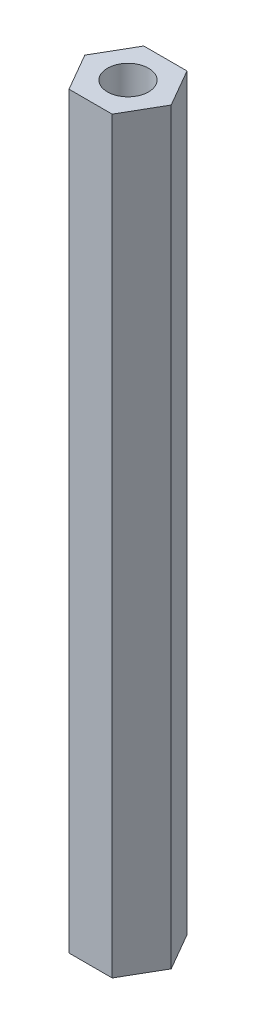
ISO-10303-21;
HEADER;
FILE_DESCRIPTION(('STEP AP214'),'2;1');
FILE_NAME('part.step','',(''),(''),'','','');
FILE_SCHEMA(('AUTOMOTIVE_DESIGN { 1 0 10303 214 1 1 1 1 }'));
ENDSEC;
DATA;
#1=APPLICATION_CONTEXT('core data for automotive mechanical design processes');
#2=APPLICATION_PROTOCOL_DEFINITION('international standard','automotive_design',2000,#1);
#3=PRODUCT_CONTEXT('',#1,'mechanical');
#4=PRODUCT('Part','Part','',(#3));
#5=PRODUCT_RELATED_PRODUCT_CATEGORY('part','',(#4));
#6=PRODUCT_DEFINITION_FORMATION('','',#4);
#7=PRODUCT_DEFINITION_CONTEXT('part definition',#1,'design');
#8=PRODUCT_DEFINITION('design','',#6,#7);
#9=PRODUCT_DEFINITION_SHAPE('','',#8);
#10=(LENGTH_UNIT() NAMED_UNIT(*) SI_UNIT(.MILLI.,.METRE.));
#11=(NAMED_UNIT(*) PLANE_ANGLE_UNIT() SI_UNIT($,.RADIAN.));
#12=(NAMED_UNIT(*) SI_UNIT($,.STERADIAN.) SOLID_ANGLE_UNIT());
#13=UNCERTAINTY_MEASURE_WITH_UNIT(LENGTH_MEASURE(1.E-05),#10,'distance_accuracy_value','');
#14=(GEOMETRIC_REPRESENTATION_CONTEXT(3) GLOBAL_UNCERTAINTY_ASSIGNED_CONTEXT((#13)) GLOBAL_UNIT_ASSIGNED_CONTEXT((#10,
#11,#12)) REPRESENTATION_CONTEXT('',''));
#15=CARTESIAN_POINT('',(0.,0.,0.));
#16=DIRECTION('',(0.,0.,1.));
#17=DIRECTION('',(1.,0.,0.));
#18=AXIS2_PLACEMENT_3D('',#15,#16,#17);
#19=CARTESIAN_POINT('',(1.73205080756891,30.,2.99999999999997));
#20=DIRECTION('',(-0.866025403784441,0.,-0.499999999999995));
#21=DIRECTION('',(-0.499999999999995,0.,0.866025403784441));
#22=AXIS2_PLACEMENT_3D('',#19,#20,#21);
#23=PLANE('',#22);
#24=DIRECTION('',(0.499999999999995,0.,-0.866025403784441));
#25=VECTOR('',#24,1.);
#26=CARTESIAN_POINT('',(1.73205080756891,-30.,2.99999999999997));
#27=LINE('',#26,#25);
#28=CARTESIAN_POINT('',(1.73205080756891,-30.,2.99999999999997));
#29=VERTEX_POINT('',#28);
#30=CARTESIAN_POINT('',(3.46410161513774,-30.,0.));
#31=VERTEX_POINT('',#30);
#32=EDGE_CURVE('E135',#29,#31,#27,.T.);
#33=ORIENTED_EDGE('',*,*,#32,.T.);
#34=DIRECTION('',(0.,-1.,0.));
#35=VECTOR('',#34,1.);
#36=CARTESIAN_POINT('',(3.46410161513774,30.,0.));
#37=LINE('',#36,#35);
#38=CARTESIAN_POINT('',(3.46410161513774,30.,0.));
#39=VERTEX_POINT('',#38);
#40=EDGE_CURVE('E11',#39,#31,#37,.T.);
#41=ORIENTED_EDGE('',*,*,#40,.F.);
#42=DIRECTION('',(0.499999999999995,0.,-0.866025403784441));
#43=VECTOR('',#42,1.);
#44=CARTESIAN_POINT('',(1.73205080756891,30.,2.99999999999997));
#45=LINE('',#44,#43);
#46=CARTESIAN_POINT('',(1.73205080756891,30.,2.99999999999997));
#47=VERTEX_POINT('',#46);
#48=EDGE_CURVE('E152',#47,#39,#45,.T.);
#49=ORIENTED_EDGE('',*,*,#48,.F.);
#50=DIRECTION('',(0.,-1.,0.));
#51=VECTOR('',#50,1.);
#52=CARTESIAN_POINT('',(1.73205080756891,30.,2.99999999999997));
#53=LINE('',#52,#51);
#54=EDGE_CURVE('E131',#47,#29,#53,.T.);
#55=ORIENTED_EDGE('',*,*,#54,.T.);
#56=EDGE_LOOP('',(#33,#41,#49,#55));
#57=FACE_BOUND('',#56,.T.);
#58=ADVANCED_FACE('F43',(#57),#23,.F.);
#59=CARTESIAN_POINT('',(3.46410161513774,30.,0.));
#60=DIRECTION('',(-0.866025403784438,0.,0.500000000000001));
#61=DIRECTION('',(0.500000000000001,0.,0.866025403784438));
#62=AXIS2_PLACEMENT_3D('',#59,#60,#61);
#63=PLANE('',#62);
#64=DIRECTION('',(-0.500000000000001,0.,-0.866025403784438));
#65=VECTOR('',#64,1.);
#66=CARTESIAN_POINT('',(3.46410161513774,-30.,0.));
#67=LINE('',#66,#65);
#68=CARTESIAN_POINT('',(1.73205080756886,-30.,-2.99999999999999));
#69=VERTEX_POINT('',#68);
#70=EDGE_CURVE('E139',#31,#69,#67,.T.);
#71=ORIENTED_EDGE('',*,*,#70,.T.);
#72=DIRECTION('',(0.,-1.,0.));
#73=VECTOR('',#72,1.);
#74=CARTESIAN_POINT('',(1.73205080756886,30.,-2.99999999999999));
#75=LINE('',#74,#73);
#76=CARTESIAN_POINT('',(1.73205080756886,30.,-2.99999999999999));
#77=VERTEX_POINT('',#76);
#78=EDGE_CURVE('E52',#77,#69,#75,.T.);
#79=ORIENTED_EDGE('',*,*,#78,.F.);
#80=DIRECTION('',(-0.500000000000001,0.,-0.866025403784438));
#81=VECTOR('',#80,1.);
#82=CARTESIAN_POINT('',(3.46410161513774,30.,0.));
#83=LINE('',#82,#81);
#84=EDGE_CURVE('E98',#39,#77,#83,.T.);
#85=ORIENTED_EDGE('',*,*,#84,.F.);
#86=ORIENTED_EDGE('',*,*,#40,.T.);
#87=EDGE_LOOP('',(#71,#79,#85,#86));
#88=FACE_BOUND('',#87,.T.);
#89=ADVANCED_FACE('F181',(#88),#63,.F.);
#90=CARTESIAN_POINT('',(1.73205080756886,30.,-2.99999999999999));
#91=DIRECTION('',(0.,0.,1.));
#92=DIRECTION('',(1.,0.,0.));
#93=AXIS2_PLACEMENT_3D('',#90,#91,#92);
#94=PLANE('',#93);
#95=DIRECTION('',(-1.,0.,0.));
#96=VECTOR('',#95,1.);
#97=CARTESIAN_POINT('',(1.73205080756886,-30.,-2.99999999999999));
#98=LINE('',#97,#96);
#99=CARTESIAN_POINT('',(-1.73205080756888,-30.,-2.99999999999998));
#100=VERTEX_POINT('',#99);
#101=EDGE_CURVE('E143',#69,#100,#98,.T.);
#102=ORIENTED_EDGE('',*,*,#101,.T.);
#103=DIRECTION('',(0.,-1.,0.));
#104=VECTOR('',#103,1.);
#105=CARTESIAN_POINT('',(-1.73205080756888,30.,-2.99999999999998));
#106=LINE('',#105,#104);
#107=CARTESIAN_POINT('',(-1.73205080756888,30.,-2.99999999999998));
#108=VERTEX_POINT('',#107);
#109=EDGE_CURVE('E124',#108,#100,#106,.T.);
#110=ORIENTED_EDGE('',*,*,#109,.F.);
#111=DIRECTION('',(-1.,0.,0.));
#112=VECTOR('',#111,1.);
#113=CARTESIAN_POINT('',(1.73205080756886,30.,-2.99999999999999));
#114=LINE('',#113,#112);
#115=EDGE_CURVE('E113',#77,#108,#114,.T.);
#116=ORIENTED_EDGE('',*,*,#115,.F.);
#117=ORIENTED_EDGE('',*,*,#78,.T.);
#118=EDGE_LOOP('',(#102,#110,#116,#117));
#119=FACE_BOUND('',#118,.T.);
#120=ADVANCED_FACE('F162',(#119),#94,.F.);
#121=CARTESIAN_POINT('',(-1.73205080756888,30.,-2.99999999999998));
#122=DIRECTION('',(0.866025403784441,0.,0.499999999999995));
#123=DIRECTION('',(0.499999999999995,0.,-0.866025403784442));
#124=AXIS2_PLACEMENT_3D('',#121,#122,#123);
#125=PLANE('',#124);
#126=DIRECTION('',(-0.499999999999995,0.,0.866025403784442));
#127=VECTOR('',#126,1.);
#128=CARTESIAN_POINT('',(-1.73205080756888,-30.,-2.99999999999998));
#129=LINE('',#128,#127);
#130=CARTESIAN_POINT('',(-3.46410161513774,-30.,0.));
#131=VERTEX_POINT('',#130);
#132=EDGE_CURVE('E122',#100,#131,#129,.T.);
#133=ORIENTED_EDGE('',*,*,#132,.T.);
#134=DIRECTION('',(0.,-1.,0.));
#135=VECTOR('',#134,1.);
#136=CARTESIAN_POINT('',(-3.46410161513774,30.,0.));
#137=LINE('',#136,#135);
#138=CARTESIAN_POINT('',(-3.46410161513774,30.,0.));
#139=VERTEX_POINT('',#138);
#140=EDGE_CURVE('E119',#139,#131,#137,.T.);
#141=ORIENTED_EDGE('',*,*,#140,.F.);
#142=DIRECTION('',(-0.499999999999995,0.,0.866025403784442));
#143=VECTOR('',#142,1.);
#144=CARTESIAN_POINT('',(-1.73205080756888,30.,-2.99999999999998));
#145=LINE('',#144,#143);
#146=EDGE_CURVE('E107',#108,#139,#145,.T.);
#147=ORIENTED_EDGE('',*,*,#146,.F.);
#148=ORIENTED_EDGE('',*,*,#109,.T.);
#149=EDGE_LOOP('',(#133,#141,#147,#148));
#150=FACE_BOUND('',#149,.T.);
#151=ADVANCED_FACE('F120',(#150),#125,.F.);
#152=CARTESIAN_POINT('',(-3.46410161513774,30.,0.));
#153=DIRECTION('',(0.866025403784435,0.,-0.500000000000007));
#154=DIRECTION('',(-0.500000000000007,0.,-0.866025403784435));
#155=AXIS2_PLACEMENT_3D('',#152,#153,#154);
#156=PLANE('',#155);
#157=DIRECTION('',(0.500000000000007,0.,0.866025403784435));
#158=VECTOR('',#157,1.);
#159=CARTESIAN_POINT('',(-3.46410161513774,-30.,0.));
#160=LINE('',#159,#158);
#161=CARTESIAN_POINT('',(-1.73205080756884,-30.,3.));
#162=VERTEX_POINT('',#161);
#163=EDGE_CURVE('E84',#131,#162,#160,.T.);
#164=ORIENTED_EDGE('',*,*,#163,.T.);
#165=DIRECTION('',(0.,-1.,0.));
#166=VECTOR('',#165,1.);
#167=CARTESIAN_POINT('',(-1.73205080756884,30.,3.));
#168=LINE('',#167,#166);
#169=CARTESIAN_POINT('',(-1.73205080756884,30.,3.));
#170=VERTEX_POINT('',#169);
#171=EDGE_CURVE('E125',#170,#162,#168,.T.);
#172=ORIENTED_EDGE('',*,*,#171,.F.);
#173=DIRECTION('',(0.500000000000007,0.,0.866025403784435));
#174=VECTOR('',#173,1.);
#175=CARTESIAN_POINT('',(-3.46410161513774,30.,0.));
#176=LINE('',#175,#174);
#177=EDGE_CURVE('E111',#139,#170,#176,.T.);
#178=ORIENTED_EDGE('',*,*,#177,.F.);
#179=ORIENTED_EDGE('',*,*,#140,.T.);
#180=EDGE_LOOP('',(#164,#172,#178,#179));
#181=FACE_BOUND('',#180,.T.);
#182=ADVANCED_FACE('F127',(#181),#156,.F.);
#183=CARTESIAN_POINT('',(-1.73205080756884,30.,3.));
#184=DIRECTION('',(0.,0.,-1.));
#185=DIRECTION('',(-1.,0.,0.));
#186=AXIS2_PLACEMENT_3D('',#183,#184,#185);
#187=PLANE('',#186);
#188=DIRECTION('',(1.,0.,0.));
#189=VECTOR('',#188,1.);
#190=CARTESIAN_POINT('',(-1.73205080756884,-30.,3.));
#191=LINE('',#190,#189);
#192=EDGE_CURVE('E90',#162,#29,#191,.T.);
#193=ORIENTED_EDGE('',*,*,#192,.T.);
#194=ORIENTED_EDGE('',*,*,#54,.F.);
#195=DIRECTION('',(1.,0.,0.));
#196=VECTOR('',#195,1.);
#197=CARTESIAN_POINT('',(-1.73205080756884,30.,3.));
#198=LINE('',#197,#196);
#199=EDGE_CURVE('E60',#170,#47,#198,.T.);
#200=ORIENTED_EDGE('',*,*,#199,.F.);
#201=ORIENTED_EDGE('',*,*,#171,.T.);
#202=EDGE_LOOP('',(#193,#194,#200,#201));
#203=FACE_BOUND('',#202,.T.);
#204=ADVANCED_FACE('F169',(#203),#187,.F.);
#205=CARTESIAN_POINT('',(0.,30.,0.));
#206=DIRECTION('',(0.,1.,0.));
#207=DIRECTION('',(0.,0.,1.));
#208=AXIS2_PLACEMENT_3D('',#205,#206,#207);
#209=PLANE('',#208);
#210=CARTESIAN_POINT('',(0.,30.,0.));
#211=DIRECTION('',(0.,1.,0.));
#212=DIRECTION('',(0.,0.,1.));
#213=AXIS2_PLACEMENT_3D('',#210,#211,#212);
#214=CIRCLE('',#213,1.64999999999999);
#215=CARTESIAN_POINT('',(0.,30.,1.64999999999999));
#216=VERTEX_POINT('',#215);
#217=EDGE_CURVE('E275',#216,#216,#214,.T.);
#218=ORIENTED_EDGE('',*,*,#217,.F.);
#219=EDGE_LOOP('',(#218));
#220=FACE_BOUND('',#219,.T.);
#221=ORIENTED_EDGE('',*,*,#48,.T.);
#222=ORIENTED_EDGE('',*,*,#84,.T.);
#223=ORIENTED_EDGE('',*,*,#115,.T.);
#224=ORIENTED_EDGE('',*,*,#146,.T.);
#225=ORIENTED_EDGE('',*,*,#177,.T.);
#226=ORIENTED_EDGE('',*,*,#199,.T.);
#227=EDGE_LOOP('',(#221,#222,#223,#224,#225,#226));
#228=FACE_BOUND('',#227,.T.);
#229=ADVANCED_FACE('F109',(#220,#228),#209,.T.);
#230=CARTESIAN_POINT('',(0.,-30.,0.));
#231=DIRECTION('',(0.,1.,0.));
#232=DIRECTION('',(0.,0.,1.));
#233=AXIS2_PLACEMENT_3D('',#230,#231,#232);
#234=PLANE('',#233);
#235=CARTESIAN_POINT('',(0.,-30.,0.));
#236=DIRECTION('',(0.,-1.,0.));
#237=DIRECTION('',(0.,0.,-1.));
#238=AXIS2_PLACEMENT_3D('',#235,#236,#237);
#239=CIRCLE('',#238,1.64999999999999);
#240=CARTESIAN_POINT('',(0.,-30.,-1.64999999999999));
#241=VERTEX_POINT('',#240);
#242=EDGE_CURVE('E271',#241,#241,#239,.T.);
#243=ORIENTED_EDGE('',*,*,#242,.F.);
#244=EDGE_LOOP('',(#243));
#245=FACE_BOUND('',#244,.T.);
#246=ORIENTED_EDGE('',*,*,#32,.F.);
#247=ORIENTED_EDGE('',*,*,#192,.F.);
#248=ORIENTED_EDGE('',*,*,#163,.F.);
#249=ORIENTED_EDGE('',*,*,#132,.F.);
#250=ORIENTED_EDGE('',*,*,#101,.F.);
#251=ORIENTED_EDGE('',*,*,#70,.F.);
#252=EDGE_LOOP('',(#246,#247,#248,#249,#250,#251));
#253=FACE_BOUND('',#252,.T.);
#254=ADVANCED_FACE('F165',(#245,#253),#234,.F.);
#255=CARTESIAN_POINT('',(0.,19.9,0.));
#256=DIRECTION('',(0.,1.,0.));
#257=DIRECTION('',(0.,0.,1.));
#258=AXIS2_PLACEMENT_3D('',#255,#256,#257);
#259=CONICAL_SURFACE('',#258,1.64999999999999,1.02974425867665);
#260=CARTESIAN_POINT('',(0.,18.9085799786045,0.));
#261=VERTEX_POINT('',#260);
#262=VERTEX_LOOP('',#261);
#263=FACE_BOUND('',#262,.T.);
#264=CARTESIAN_POINT('',(0.,19.9,0.));
#265=DIRECTION('',(0.,1.,0.));
#266=DIRECTION('',(0.,0.,1.));
#267=AXIS2_PLACEMENT_3D('',#264,#265,#266);
#268=CIRCLE('',#267,1.64999999999999);
#269=CARTESIAN_POINT('',(0.,19.9,1.64999999999999));
#270=VERTEX_POINT('',#269);
#271=EDGE_CURVE('E140',#270,#270,#268,.T.);
#272=ORIENTED_EDGE('',*,*,#271,.T.);
#273=EDGE_LOOP('',(#272));
#274=FACE_BOUND('',#273,.T.);
#275=ADVANCED_FACE('F216',(#263,#274),#259,.F.);
#276=CARTESIAN_POINT('',(0.,30.,0.));
#277=DIRECTION('',(0.,1.,0.));
#278=DIRECTION('',(0.,0.,1.));
#279=AXIS2_PLACEMENT_3D('',#276,#277,#278);
#280=CYLINDRICAL_SURFACE('',#279,1.64999999999999);
#281=ORIENTED_EDGE('',*,*,#271,.F.);
#282=EDGE_LOOP('',(#281));
#283=FACE_BOUND('',#282,.T.);
#284=ORIENTED_EDGE('',*,*,#217,.T.);
#285=EDGE_LOOP('',(#284));
#286=FACE_BOUND('',#285,.T.);
#287=ADVANCED_FACE('F221',(#283,#286),#280,.F.);
#288=CARTESIAN_POINT('',(0.,-19.9,0.));
#289=DIRECTION('',(0.,-1.,0.));
#290=DIRECTION('',(0.,0.,-1.));
#291=AXIS2_PLACEMENT_3D('',#288,#289,#290);
#292=CONICAL_SURFACE('',#291,1.64999999999999,1.02974425867665);
#293=CARTESIAN_POINT('',(0.,-18.9085799786045,0.));
#294=VERTEX_POINT('',#293);
#295=VERTEX_LOOP('',#294);
#296=FACE_BOUND('',#295,.T.);
#297=CARTESIAN_POINT('',(0.,-19.9,0.));
#298=DIRECTION('',(0.,-1.,0.));
#299=DIRECTION('',(0.,0.,-1.));
#300=AXIS2_PLACEMENT_3D('',#297,#298,#299);
#301=CIRCLE('',#300,1.64999999999999);
#302=CARTESIAN_POINT('',(0.,-19.9,-1.64999999999999));
#303=VERTEX_POINT('',#302);
#304=EDGE_CURVE('E268',#303,#303,#301,.T.);
#305=ORIENTED_EDGE('',*,*,#304,.T.);
#306=EDGE_LOOP('',(#305));
#307=FACE_BOUND('',#306,.T.);
#308=ADVANCED_FACE('F232',(#296,#307),#292,.F.);
#309=CARTESIAN_POINT('',(0.,-30.,0.));
#310=DIRECTION('',(0.,-1.,0.));
#311=DIRECTION('',(0.,0.,-1.));
#312=AXIS2_PLACEMENT_3D('',#309,#310,#311);
#313=CYLINDRICAL_SURFACE('',#312,1.64999999999999);
#314=ORIENTED_EDGE('',*,*,#304,.F.);
#315=EDGE_LOOP('',(#314));
#316=FACE_BOUND('',#315,.T.);
#317=ORIENTED_EDGE('',*,*,#242,.T.);
#318=EDGE_LOOP('',(#317));
#319=FACE_BOUND('',#318,.T.);
#320=ADVANCED_FACE('F250',(#316,#319),#313,.F.);
#321=CLOSED_SHELL('',(#58,#89,#120,#151,#182,#204,#229,#254,#275,#287,#308,#320));
#322=MANIFOLD_SOLID_BREP('B2',#321);
#323=ADVANCED_BREP_SHAPE_REPRESENTATION('',(#18,#322),#14);
#324=SHAPE_DEFINITION_REPRESENTATION(#9,#323);
ENDSEC;
END-ISO-10303-21;
